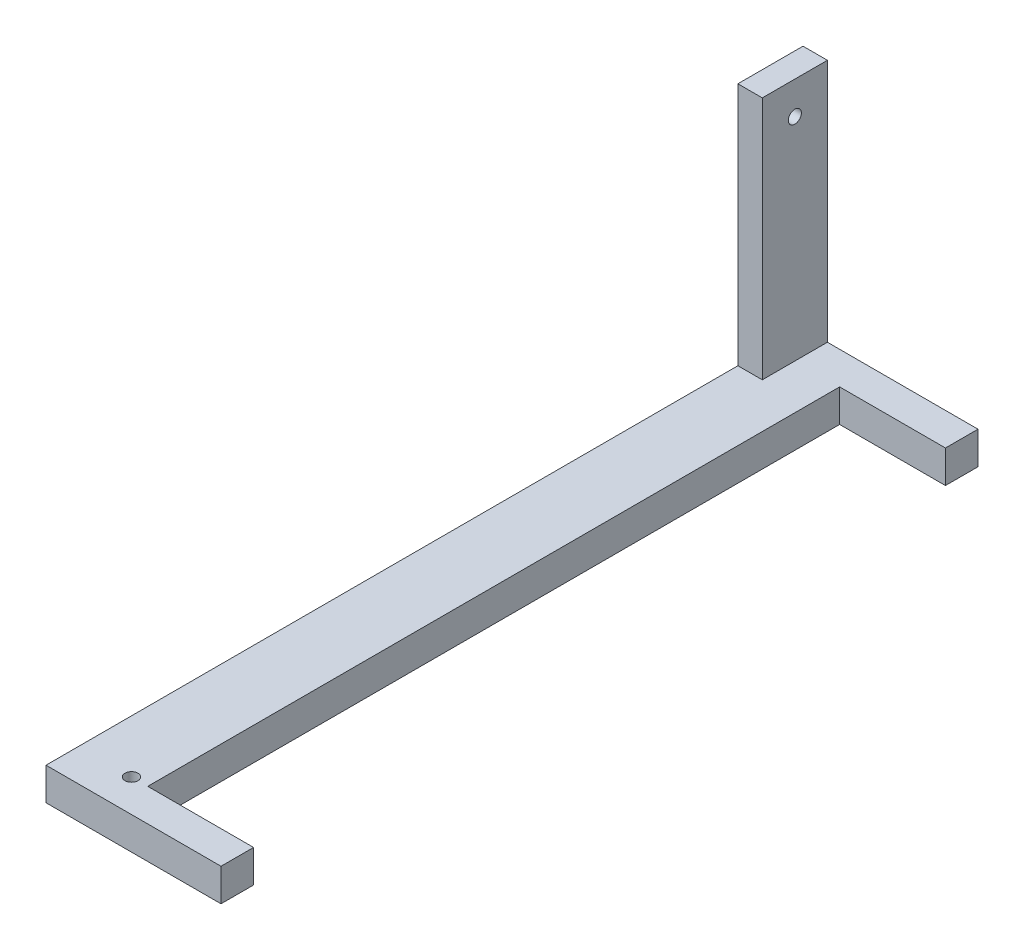
ISO-10303-21;
HEADER;
FILE_DESCRIPTION(('STEP AP214'),'2;1');
FILE_NAME('part.step','',(''),(''),'','','');
FILE_SCHEMA(('AUTOMOTIVE_DESIGN { 1 0 10303 214 1 1 1 1 }'));
ENDSEC;
DATA;
#1=APPLICATION_CONTEXT('core data for automotive mechanical design processes');
#2=APPLICATION_PROTOCOL_DEFINITION('international standard','automotive_design',2000,#1);
#3=PRODUCT_CONTEXT('',#1,'mechanical');
#4=PRODUCT('Part','Part','',(#3));
#5=PRODUCT_RELATED_PRODUCT_CATEGORY('part','',(#4));
#6=PRODUCT_DEFINITION_FORMATION('','',#4);
#7=PRODUCT_DEFINITION_CONTEXT('part definition',#1,'design');
#8=PRODUCT_DEFINITION('design','',#6,#7);
#9=PRODUCT_DEFINITION_SHAPE('','',#8);
#10=(LENGTH_UNIT() NAMED_UNIT(*) SI_UNIT(.MILLI.,.METRE.));
#11=(NAMED_UNIT(*) PLANE_ANGLE_UNIT() SI_UNIT($,.RADIAN.));
#12=(NAMED_UNIT(*) SI_UNIT($,.STERADIAN.) SOLID_ANGLE_UNIT());
#13=UNCERTAINTY_MEASURE_WITH_UNIT(LENGTH_MEASURE(1.E-05),#10,'distance_accuracy_value','');
#14=(GEOMETRIC_REPRESENTATION_CONTEXT(3) GLOBAL_UNCERTAINTY_ASSIGNED_CONTEXT((#13)) GLOBAL_UNIT_ASSIGNED_CONTEXT((#10,
#11,#12)) REPRESENTATION_CONTEXT('',''));
#15=CARTESIAN_POINT('',(0.,0.,0.));
#16=DIRECTION('',(0.,0.,1.));
#17=DIRECTION('',(1.,0.,0.));
#18=AXIS2_PLACEMENT_3D('',#15,#16,#17);
#19=CARTESIAN_POINT('',(4.,0.,-178.));
#20=DIRECTION('',(0.,-1.,0.));
#21=DIRECTION('',(0.,0.,-1.));
#22=AXIS2_PLACEMENT_3D('',#19,#20,#21);
#23=PLANE('',#22);
#24=DIRECTION('',(-1.,0.,0.));
#25=VECTOR('',#24,1.);
#26=CARTESIAN_POINT('',(4.,0.,-178.));
#27=LINE('',#26,#25);
#28=CARTESIAN_POINT('',(30.,0.,-178.));
#29=VERTEX_POINT('',#28);
#30=CARTESIAN_POINT('',(-7.,0.,-178.));
#31=VERTEX_POINT('',#30);
#32=EDGE_CURVE('E124',#29,#31,#27,.T.);
#33=ORIENTED_EDGE('',*,*,#32,.T.);
#34=DIRECTION('',(0.,0.,1.));
#35=VECTOR('',#34,1.);
#36=CARTESIAN_POINT('',(-7.,0.,-170.));
#37=LINE('',#36,#35);
#38=CARTESIAN_POINT('',(-7.,0.,-162.));
#39=VERTEX_POINT('',#38);
#40=EDGE_CURVE('E164',#31,#39,#37,.T.);
#41=ORIENTED_EDGE('',*,*,#40,.T.);
#42=DIRECTION('',(1.,0.,0.));
#43=VECTOR('',#42,1.);
#44=CARTESIAN_POINT('',(-13.,0.,-162.));
#45=LINE('',#44,#43);
#46=CARTESIAN_POINT('',(-13.,0.,-162.));
#47=VERTEX_POINT('',#46);
#48=EDGE_CURVE('E162',#47,#39,#45,.T.);
#49=ORIENTED_EDGE('',*,*,#48,.F.);
#50=DIRECTION('',(0.,0.,-1.));
#51=VECTOR('',#50,1.);
#52=CARTESIAN_POINT('',(-13.,0.,8.));
#53=LINE('',#52,#51);
#54=CARTESIAN_POINT('',(-13.,0.,8.));
#55=VERTEX_POINT('',#54);
#56=EDGE_CURVE('E149',#55,#47,#53,.T.);
#57=ORIENTED_EDGE('',*,*,#56,.F.);
#58=DIRECTION('',(-1.,0.,0.));
#59=VECTOR('',#58,1.);
#60=CARTESIAN_POINT('',(4.,0.,8.));
#61=LINE('',#60,#59);
#62=CARTESIAN_POINT('',(30.,0.,8.));
#63=VERTEX_POINT('',#62);
#64=EDGE_CURVE('E11',#63,#55,#61,.T.);
#65=ORIENTED_EDGE('',*,*,#64,.F.);
#66=DIRECTION('',(0.,0.,1.));
#67=VECTOR('',#66,1.);
#68=CARTESIAN_POINT('',(30.,0.,8.));
#69=LINE('',#68,#67);
#70=CARTESIAN_POINT('',(30.,0.,0.));
#71=VERTEX_POINT('',#70);
#72=EDGE_CURVE('E189',#71,#63,#69,.T.);
#73=ORIENTED_EDGE('',*,*,#72,.F.);
#74=DIRECTION('',(-1.,0.,0.));
#75=VECTOR('',#74,1.);
#76=CARTESIAN_POINT('',(30.,0.,0.));
#77=LINE('',#76,#75);
#78=CARTESIAN_POINT('',(4.,0.,0.));
#79=VERTEX_POINT('',#78);
#80=EDGE_CURVE('E192',#71,#79,#77,.T.);
#81=ORIENTED_EDGE('',*,*,#80,.T.);
#82=DIRECTION('',(0.,0.,1.));
#83=VECTOR('',#82,1.);
#84=CARTESIAN_POINT('',(4.,0.,-170.));
#85=LINE('',#84,#83);
#86=CARTESIAN_POINT('',(4.,0.,-170.));
#87=VERTEX_POINT('',#86);
#88=EDGE_CURVE('E200',#87,#79,#85,.T.);
#89=ORIENTED_EDGE('',*,*,#88,.F.);
#90=DIRECTION('',(-1.,0.,0.));
#91=VECTOR('',#90,1.);
#92=CARTESIAN_POINT('',(30.,0.,-170.));
#93=LINE('',#92,#91);
#94=CARTESIAN_POINT('',(30.,0.,-170.));
#95=VERTEX_POINT('',#94);
#96=EDGE_CURVE('E178',#95,#87,#93,.T.);
#97=ORIENTED_EDGE('',*,*,#96,.F.);
#98=DIRECTION('',(0.,0.,1.));
#99=VECTOR('',#98,1.);
#100=CARTESIAN_POINT('',(30.,0.,-178.));
#101=LINE('',#100,#99);
#102=EDGE_CURVE('E168',#29,#95,#101,.T.);
#103=ORIENTED_EDGE('',*,*,#102,.F.);
#104=EDGE_LOOP('',(#33,#41,#49,#57,#65,#73,#81,#89,#97,#103));
#105=FACE_BOUND('',#104,.T.);
#106=CARTESIAN_POINT('',(0.,0.,0.));
#107=DIRECTION('',(0.,1.,0.));
#108=DIRECTION('',(0.,0.,1.));
#109=AXIS2_PLACEMENT_3D('',#106,#107,#108);
#110=CIRCLE('',#109,1.59999999999999);
#111=CARTESIAN_POINT('',(0.,0.,1.59999999999999));
#112=VERTEX_POINT('',#111);
#113=EDGE_CURVE('E251',#112,#112,#110,.T.);
#114=ORIENTED_EDGE('',*,*,#113,.F.);
#115=EDGE_LOOP('',(#114));
#116=FACE_BOUND('',#115,.T.);
#117=ADVANCED_FACE('F33',(#105,#116),#23,.F.);
#118=CARTESIAN_POINT('',(4.,0.,0.));
#119=DIRECTION('',(1.,0.,0.));
#120=DIRECTION('',(0.,0.,-1.));
#121=AXIS2_PLACEMENT_3D('',#118,#119,#120);
#122=PLANE('',#121);
#123=DIRECTION('',(0.,0.,-1.));
#124=VECTOR('',#123,1.);
#125=CARTESIAN_POINT('',(4.,-8.,8.));
#126=LINE('',#125,#124);
#127=CARTESIAN_POINT('',(4.,-8.,0.));
#128=VERTEX_POINT('',#127);
#129=CARTESIAN_POINT('',(4.,-8.,-170.));
#130=VERTEX_POINT('',#129);
#131=EDGE_CURVE('E53',#128,#130,#126,.T.);
#132=ORIENTED_EDGE('',*,*,#131,.T.);
#133=DIRECTION('',(0.,-1.,0.));
#134=VECTOR('',#133,1.);
#135=CARTESIAN_POINT('',(4.,0.,-170.));
#136=LINE('',#135,#134);
#137=EDGE_CURVE('E48',#87,#130,#136,.T.);
#138=ORIENTED_EDGE('',*,*,#137,.F.);
#139=ORIENTED_EDGE('',*,*,#88,.T.);
#140=DIRECTION('',(0.,1.,0.));
#141=VECTOR('',#140,1.);
#142=CARTESIAN_POINT('',(4.,-8.,0.));
#143=LINE('',#142,#141);
#144=EDGE_CURVE('E181',#128,#79,#143,.T.);
#145=ORIENTED_EDGE('',*,*,#144,.F.);
#146=EDGE_LOOP('',(#132,#138,#139,#145));
#147=FACE_BOUND('',#146,.T.);
#148=ADVANCED_FACE('F232',(#147),#122,.T.);
#149=CARTESIAN_POINT('',(4.,0.,8.));
#150=DIRECTION('',(0.,0.,-1.));
#151=DIRECTION('',(-1.,0.,0.));
#152=AXIS2_PLACEMENT_3D('',#149,#150,#151);
#153=PLANE('',#152);
#154=ORIENTED_EDGE('',*,*,#64,.T.);
#155=DIRECTION('',(0.,1.,0.));
#156=VECTOR('',#155,1.);
#157=CARTESIAN_POINT('',(-13.,-8.,8.));
#158=LINE('',#157,#156);
#159=CARTESIAN_POINT('',(-13.,-8.,8.));
#160=VERTEX_POINT('',#159);
#161=EDGE_CURVE('E133',#160,#55,#158,.T.);
#162=ORIENTED_EDGE('',*,*,#161,.F.);
#163=DIRECTION('',(-1.,0.,0.));
#164=VECTOR('',#163,1.);
#165=CARTESIAN_POINT('',(4.,-8.,8.));
#166=LINE('',#165,#164);
#167=CARTESIAN_POINT('',(30.,-8.,8.));
#168=VERTEX_POINT('',#167);
#169=EDGE_CURVE('E41',#168,#160,#166,.T.);
#170=ORIENTED_EDGE('',*,*,#169,.F.);
#171=DIRECTION('',(0.,-1.,0.));
#172=VECTOR('',#171,1.);
#173=CARTESIAN_POINT('',(30.,-8.,8.));
#174=LINE('',#173,#172);
#175=EDGE_CURVE('E182',#63,#168,#174,.T.);
#176=ORIENTED_EDGE('',*,*,#175,.F.);
#177=EDGE_LOOP('',(#154,#162,#170,#176));
#178=FACE_BOUND('',#177,.T.);
#179=ADVANCED_FACE('F35',(#178),#153,.F.);
#180=CARTESIAN_POINT('',(4.,-8.,8.));
#181=DIRECTION('',(0.,1.,0.));
#182=DIRECTION('',(0.,0.,1.));
#183=AXIS2_PLACEMENT_3D('',#180,#181,#182);
#184=PLANE('',#183);
#185=CARTESIAN_POINT('',(0.,-8.,0.));
#186=DIRECTION('',(0.,1.,0.));
#187=DIRECTION('',(0.,0.,1.));
#188=AXIS2_PLACEMENT_3D('',#185,#186,#187);
#189=CIRCLE('',#188,1.6);
#190=CARTESIAN_POINT('',(0.,-8.,1.6));
#191=VERTEX_POINT('',#190);
#192=EDGE_CURVE('E145',#191,#191,#189,.T.);
#193=ORIENTED_EDGE('',*,*,#192,.T.);
#194=EDGE_LOOP('',(#193));
#195=FACE_BOUND('',#194,.T.);
#196=ORIENTED_EDGE('',*,*,#169,.T.);
#197=DIRECTION('',(0.,0.,1.));
#198=VECTOR('',#197,1.);
#199=CARTESIAN_POINT('',(-13.,-8.,8.));
#200=LINE('',#199,#198);
#201=CARTESIAN_POINT('',(-13.,-8.,-178.));
#202=VERTEX_POINT('',#201);
#203=EDGE_CURVE('E127',#202,#160,#200,.T.);
#204=ORIENTED_EDGE('',*,*,#203,.F.);
#205=DIRECTION('',(-1.,0.,0.));
#206=VECTOR('',#205,1.);
#207=CARTESIAN_POINT('',(4.,-8.,-178.));
#208=LINE('',#207,#206);
#209=CARTESIAN_POINT('',(30.,-8.,-178.));
#210=VERTEX_POINT('',#209);
#211=EDGE_CURVE('E112',#210,#202,#208,.T.);
#212=ORIENTED_EDGE('',*,*,#211,.F.);
#213=DIRECTION('',(0.,0.,-1.));
#214=VECTOR('',#213,1.);
#215=CARTESIAN_POINT('',(30.,-8.,-178.));
#216=LINE('',#215,#214);
#217=CARTESIAN_POINT('',(30.,-8.,-170.));
#218=VERTEX_POINT('',#217);
#219=EDGE_CURVE('E172',#218,#210,#216,.T.);
#220=ORIENTED_EDGE('',*,*,#219,.F.);
#221=DIRECTION('',(-1.,0.,0.));
#222=VECTOR('',#221,1.);
#223=CARTESIAN_POINT('',(30.,-8.,-170.));
#224=LINE('',#223,#222);
#225=EDGE_CURVE('E174',#218,#130,#224,.T.);
#226=ORIENTED_EDGE('',*,*,#225,.T.);
#227=ORIENTED_EDGE('',*,*,#131,.F.);
#228=DIRECTION('',(-1.,0.,0.));
#229=VECTOR('',#228,1.);
#230=CARTESIAN_POINT('',(30.,-8.,0.));
#231=LINE('',#230,#229);
#232=CARTESIAN_POINT('',(30.,-8.,0.));
#233=VERTEX_POINT('',#232);
#234=EDGE_CURVE('E197',#233,#128,#231,.T.);
#235=ORIENTED_EDGE('',*,*,#234,.F.);
#236=DIRECTION('',(0.,0.,-1.));
#237=VECTOR('',#236,1.);
#238=CARTESIAN_POINT('',(30.,-8.,8.));
#239=LINE('',#238,#237);
#240=EDGE_CURVE('E185',#168,#233,#239,.T.);
#241=ORIENTED_EDGE('',*,*,#240,.F.);
#242=EDGE_LOOP('',(#196,#204,#212,#220,#226,#227,#235,#241));
#243=FACE_BOUND('',#242,.T.);
#244=ADVANCED_FACE('F128',(#195,#243),#184,.F.);
#245=CARTESIAN_POINT('',(4.,-8.,-178.));
#246=DIRECTION('',(0.,0.,1.));
#247=DIRECTION('',(1.,0.,0.));
#248=AXIS2_PLACEMENT_3D('',#245,#246,#247);
#249=PLANE('',#248);
#250=ORIENTED_EDGE('',*,*,#211,.T.);
#251=DIRECTION('',(0.,-1.,0.));
#252=VECTOR('',#251,1.);
#253=CARTESIAN_POINT('',(-13.,-8.,-178.));
#254=LINE('',#253,#252);
#255=CARTESIAN_POINT('',(-13.,60.,-178.));
#256=VERTEX_POINT('',#255);
#257=EDGE_CURVE('E117',#256,#202,#254,.T.);
#258=ORIENTED_EDGE('',*,*,#257,.F.);
#259=DIRECTION('',(1.,0.,0.));
#260=VECTOR('',#259,1.);
#261=CARTESIAN_POINT('',(-13.,60.,-178.));
#262=LINE('',#261,#260);
#263=CARTESIAN_POINT('',(-7.,60.,-178.));
#264=VERTEX_POINT('',#263);
#265=EDGE_CURVE('E154',#256,#264,#262,.T.);
#266=ORIENTED_EDGE('',*,*,#265,.T.);
#267=DIRECTION('',(0.,-1.,0.));
#268=VECTOR('',#267,1.);
#269=CARTESIAN_POINT('',(-7.,0.,-178.));
#270=LINE('',#269,#268);
#271=EDGE_CURVE('E139',#264,#31,#270,.T.);
#272=ORIENTED_EDGE('',*,*,#271,.T.);
#273=ORIENTED_EDGE('',*,*,#32,.F.);
#274=DIRECTION('',(0.,1.,0.));
#275=VECTOR('',#274,1.);
#276=CARTESIAN_POINT('',(30.,0.,-178.));
#277=LINE('',#276,#275);
#278=EDGE_CURVE('E120',#210,#29,#277,.T.);
#279=ORIENTED_EDGE('',*,*,#278,.F.);
#280=EDGE_LOOP('',(#250,#258,#266,#272,#273,#279));
#281=FACE_BOUND('',#280,.T.);
#282=ADVANCED_FACE('F114',(#281),#249,.F.);
#283=CARTESIAN_POINT('',(30.,-8.,0.));
#284=DIRECTION('',(0.,0.,1.));
#285=DIRECTION('',(0.,-1.,0.));
#286=AXIS2_PLACEMENT_3D('',#283,#284,#285);
#287=PLANE('',#286);
#288=ORIENTED_EDGE('',*,*,#144,.T.);
#289=ORIENTED_EDGE('',*,*,#80,.F.);
#290=DIRECTION('',(0.,1.,0.));
#291=VECTOR('',#290,1.);
#292=CARTESIAN_POINT('',(30.,-8.,0.));
#293=LINE('',#292,#291);
#294=EDGE_CURVE('E187',#233,#71,#293,.T.);
#295=ORIENTED_EDGE('',*,*,#294,.F.);
#296=ORIENTED_EDGE('',*,*,#234,.T.);
#297=EDGE_LOOP('',(#288,#289,#295,#296));
#298=FACE_BOUND('',#297,.T.);
#299=ADVANCED_FACE('F241',(#298),#287,.F.);
#300=CARTESIAN_POINT('',(30.,0.,0.));
#301=DIRECTION('',(-1.,0.,0.));
#302=DIRECTION('',(0.,0.,1.));
#303=AXIS2_PLACEMENT_3D('',#300,#301,#302);
#304=PLANE('',#303);
#305=ORIENTED_EDGE('',*,*,#175,.T.);
#306=ORIENTED_EDGE('',*,*,#240,.T.);
#307=ORIENTED_EDGE('',*,*,#294,.T.);
#308=ORIENTED_EDGE('',*,*,#72,.T.);
#309=EDGE_LOOP('',(#305,#306,#307,#308));
#310=FACE_BOUND('',#309,.T.);
#311=ADVANCED_FACE('F352',(#310),#304,.F.);
#312=CARTESIAN_POINT('',(30.,0.,-170.));
#313=DIRECTION('',(0.,0.,-1.));
#314=DIRECTION('',(-1.,0.,0.));
#315=AXIS2_PLACEMENT_3D('',#312,#313,#314);
#316=PLANE('',#315);
#317=ORIENTED_EDGE('',*,*,#137,.T.);
#318=ORIENTED_EDGE('',*,*,#225,.F.);
#319=DIRECTION('',(0.,-1.,0.));
#320=VECTOR('',#319,1.);
#321=CARTESIAN_POINT('',(30.,0.,-170.));
#322=LINE('',#321,#320);
#323=EDGE_CURVE('E170',#95,#218,#322,.T.);
#324=ORIENTED_EDGE('',*,*,#323,.F.);
#325=ORIENTED_EDGE('',*,*,#96,.T.);
#326=EDGE_LOOP('',(#317,#318,#324,#325));
#327=FACE_BOUND('',#326,.T.);
#328=ADVANCED_FACE('F270',(#327),#316,.F.);
#329=CARTESIAN_POINT('',(30.,0.,0.));
#330=DIRECTION('',(-1.,0.,0.));
#331=DIRECTION('',(0.,0.,1.));
#332=AXIS2_PLACEMENT_3D('',#329,#330,#331);
#333=PLANE('',#332);
#334=ORIENTED_EDGE('',*,*,#278,.T.);
#335=ORIENTED_EDGE('',*,*,#102,.T.);
#336=ORIENTED_EDGE('',*,*,#323,.T.);
#337=ORIENTED_EDGE('',*,*,#219,.T.);
#338=EDGE_LOOP('',(#334,#335,#336,#337));
#339=FACE_BOUND('',#338,.T.);
#340=ADVANCED_FACE('F266',(#339),#333,.F.);
#341=CARTESIAN_POINT('',(-7.,0.,0.));
#342=DIRECTION('',(1.,0.,0.));
#343=DIRECTION('',(0.,0.,-1.));
#344=AXIS2_PLACEMENT_3D('',#341,#342,#343);
#345=PLANE('',#344);
#346=CARTESIAN_POINT('',(-7.,52.,-170.));
#347=DIRECTION('',(1.,0.,0.));
#348=DIRECTION('',(0.,0.,-1.));
#349=AXIS2_PLACEMENT_3D('',#346,#347,#348);
#350=CIRCLE('',#349,1.59999999999998);
#351=CARTESIAN_POINT('',(-7.,52.,-171.6));
#352=VERTEX_POINT('',#351);
#353=EDGE_CURVE('E257',#352,#352,#350,.T.);
#354=ORIENTED_EDGE('',*,*,#353,.F.);
#355=EDGE_LOOP('',(#354));
#356=FACE_BOUND('',#355,.T.);
#357=ORIENTED_EDGE('',*,*,#40,.F.);
#358=ORIENTED_EDGE('',*,*,#271,.F.);
#359=DIRECTION('',(0.,0.,-1.));
#360=VECTOR('',#359,1.);
#361=CARTESIAN_POINT('',(-7.,60.,-178.));
#362=LINE('',#361,#360);
#363=CARTESIAN_POINT('',(-7.,60.,-162.));
#364=VERTEX_POINT('',#363);
#365=EDGE_CURVE('E142',#364,#264,#362,.T.);
#366=ORIENTED_EDGE('',*,*,#365,.F.);
#367=DIRECTION('',(0.,1.,0.));
#368=VECTOR('',#367,1.);
#369=CARTESIAN_POINT('',(-7.,60.,-162.));
#370=LINE('',#369,#368);
#371=EDGE_CURVE('E155',#39,#364,#370,.T.);
#372=ORIENTED_EDGE('',*,*,#371,.F.);
#373=EDGE_LOOP('',(#357,#358,#366,#372));
#374=FACE_BOUND('',#373,.T.);
#375=ADVANCED_FACE('F212',(#356,#374),#345,.T.);
#376=CARTESIAN_POINT('',(-13.,60.,-162.));
#377=DIRECTION('',(0.,0.,-1.));
#378=DIRECTION('',(-1.,0.,0.));
#379=AXIS2_PLACEMENT_3D('',#376,#377,#378);
#380=PLANE('',#379);
#381=ORIENTED_EDGE('',*,*,#371,.T.);
#382=DIRECTION('',(1.,0.,0.));
#383=VECTOR('',#382,1.);
#384=CARTESIAN_POINT('',(-13.,60.,-162.));
#385=LINE('',#384,#383);
#386=CARTESIAN_POINT('',(-13.,60.,-162.));
#387=VERTEX_POINT('',#386);
#388=EDGE_CURVE('E159',#387,#364,#385,.T.);
#389=ORIENTED_EDGE('',*,*,#388,.F.);
#390=DIRECTION('',(0.,1.,0.));
#391=VECTOR('',#390,1.);
#392=CARTESIAN_POINT('',(-13.,60.,-162.));
#393=LINE('',#392,#391);
#394=EDGE_CURVE('E151',#47,#387,#393,.T.);
#395=ORIENTED_EDGE('',*,*,#394,.F.);
#396=ORIENTED_EDGE('',*,*,#48,.T.);
#397=EDGE_LOOP('',(#381,#389,#395,#396));
#398=FACE_BOUND('',#397,.T.);
#399=ADVANCED_FACE('F216',(#398),#380,.F.);
#400=CARTESIAN_POINT('',(-13.,60.,-178.));
#401=DIRECTION('',(0.,-1.,0.));
#402=DIRECTION('',(0.,0.,-1.));
#403=AXIS2_PLACEMENT_3D('',#400,#401,#402);
#404=PLANE('',#403);
#405=ORIENTED_EDGE('',*,*,#365,.T.);
#406=ORIENTED_EDGE('',*,*,#265,.F.);
#407=DIRECTION('',(0.,0.,-1.));
#408=VECTOR('',#407,1.);
#409=CARTESIAN_POINT('',(-13.,60.,-178.));
#410=LINE('',#409,#408);
#411=EDGE_CURVE('E137',#387,#256,#410,.T.);
#412=ORIENTED_EDGE('',*,*,#411,.F.);
#413=ORIENTED_EDGE('',*,*,#388,.T.);
#414=EDGE_LOOP('',(#405,#406,#412,#413));
#415=FACE_BOUND('',#414,.T.);
#416=ADVANCED_FACE('F219',(#415),#404,.F.);
#417=CARTESIAN_POINT('',(-13.,0.,0.));
#418=DIRECTION('',(1.,0.,0.));
#419=DIRECTION('',(0.,0.,-1.));
#420=AXIS2_PLACEMENT_3D('',#417,#418,#419);
#421=PLANE('',#420);
#422=CARTESIAN_POINT('',(-13.,52.,-170.));
#423=DIRECTION('',(1.,0.,0.));
#424=DIRECTION('',(0.,0.,-1.));
#425=AXIS2_PLACEMENT_3D('',#422,#423,#424);
#426=CIRCLE('',#425,1.6);
#427=CARTESIAN_POINT('',(-13.,52.,-171.6));
#428=VERTEX_POINT('',#427);
#429=EDGE_CURVE('E253',#428,#428,#426,.T.);
#430=ORIENTED_EDGE('',*,*,#429,.T.);
#431=EDGE_LOOP('',(#430));
#432=FACE_BOUND('',#431,.T.);
#433=ORIENTED_EDGE('',*,*,#257,.T.);
#434=ORIENTED_EDGE('',*,*,#203,.T.);
#435=ORIENTED_EDGE('',*,*,#161,.T.);
#436=ORIENTED_EDGE('',*,*,#56,.T.);
#437=ORIENTED_EDGE('',*,*,#394,.T.);
#438=ORIENTED_EDGE('',*,*,#411,.T.);
#439=EDGE_LOOP('',(#433,#434,#435,#436,#437,#438));
#440=FACE_BOUND('',#439,.T.);
#441=ADVANCED_FACE('F135',(#432,#440),#421,.F.);
#442=CARTESIAN_POINT('',(0.,0.,0.));
#443=DIRECTION('',(0.,1.,0.));
#444=DIRECTION('',(0.,0.,1.));
#445=AXIS2_PLACEMENT_3D('',#442,#443,#444);
#446=CYLINDRICAL_SURFACE('',#445,1.59999999999999);
#447=ORIENTED_EDGE('',*,*,#192,.F.);
#448=EDGE_LOOP('',(#447));
#449=FACE_BOUND('',#448,.T.);
#450=ORIENTED_EDGE('',*,*,#113,.T.);
#451=EDGE_LOOP('',(#450));
#452=FACE_BOUND('',#451,.T.);
#453=ADVANCED_FACE('F226',(#449,#452),#446,.F.);
#454=CARTESIAN_POINT('',(-7.,52.,-170.));
#455=DIRECTION('',(1.,0.,0.));
#456=DIRECTION('',(0.,0.,-1.));
#457=AXIS2_PLACEMENT_3D('',#454,#455,#456);
#458=CYLINDRICAL_SURFACE('',#457,1.59999999999999);
#459=ORIENTED_EDGE('',*,*,#429,.F.);
#460=EDGE_LOOP('',(#459));
#461=FACE_BOUND('',#460,.T.);
#462=ORIENTED_EDGE('',*,*,#353,.T.);
#463=EDGE_LOOP('',(#462));
#464=FACE_BOUND('',#463,.T.);
#465=ADVANCED_FACE('F263',(#461,#464),#458,.F.);
#466=CLOSED_SHELL('',(#117,#148,#179,#244,#282,#299,#311,#328,#340,#375,#399,#416,#441,#453,#465));
#467=MANIFOLD_SOLID_BREP('B2',#466);
#468=ADVANCED_BREP_SHAPE_REPRESENTATION('',(#18,#467),#14);
#469=SHAPE_DEFINITION_REPRESENTATION(#9,#468);
ENDSEC;
END-ISO-10303-21;
